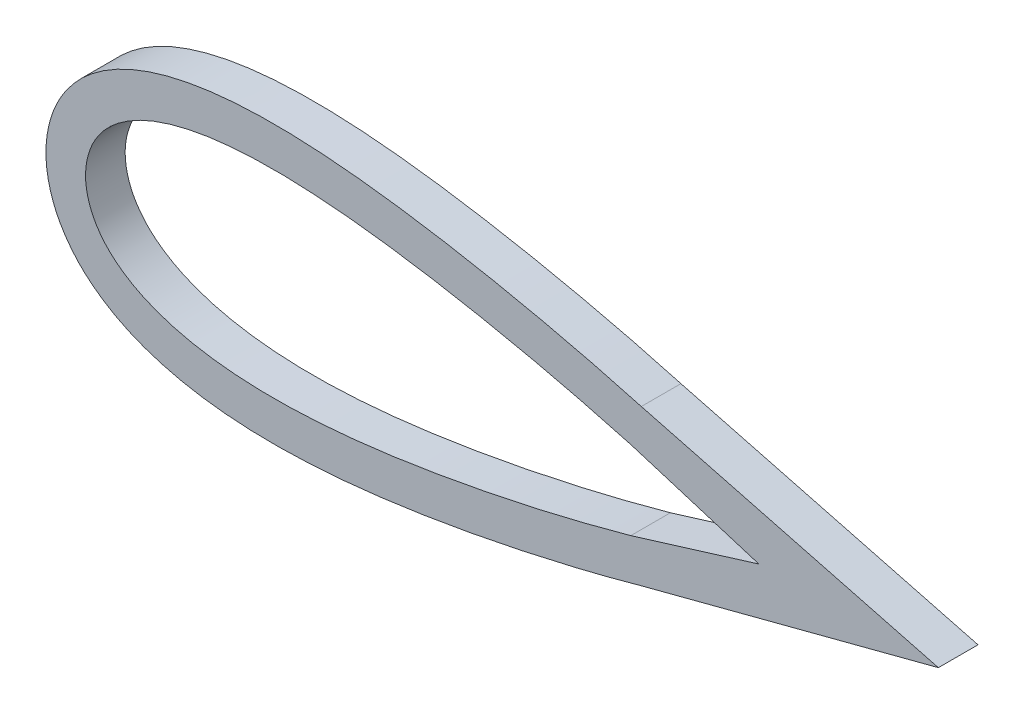
ISO-10303-21;
HEADER;
FILE_DESCRIPTION(('STEP AP214'),'2;1');
FILE_NAME('part.step','',(''),(''),'','','');
FILE_SCHEMA(('AUTOMOTIVE_DESIGN { 1 0 10303 214 1 1 1 1 }'));
ENDSEC;
DATA;
#1=APPLICATION_CONTEXT('core data for automotive mechanical design processes');
#2=APPLICATION_PROTOCOL_DEFINITION('international standard','automotive_design',2000,#1);
#3=PRODUCT_CONTEXT('',#1,'mechanical');
#4=PRODUCT('Part','Part','',(#3));
#5=PRODUCT_RELATED_PRODUCT_CATEGORY('part','',(#4));
#6=PRODUCT_DEFINITION_FORMATION('','',#4);
#7=PRODUCT_DEFINITION_CONTEXT('part definition',#1,'design');
#8=PRODUCT_DEFINITION('design','',#6,#7);
#9=PRODUCT_DEFINITION_SHAPE('','',#8);
#10=(LENGTH_UNIT() NAMED_UNIT(*) SI_UNIT(.MILLI.,.METRE.));
#11=(NAMED_UNIT(*) PLANE_ANGLE_UNIT() SI_UNIT($,.RADIAN.));
#12=(NAMED_UNIT(*) SI_UNIT($,.STERADIAN.) SOLID_ANGLE_UNIT());
#13=UNCERTAINTY_MEASURE_WITH_UNIT(LENGTH_MEASURE(1.E-05),#10,'distance_accuracy_value','');
#14=(GEOMETRIC_REPRESENTATION_CONTEXT(3) GLOBAL_UNCERTAINTY_ASSIGNED_CONTEXT((#13)) GLOBAL_UNIT_ASSIGNED_CONTEXT((#10,
#11,#12)) REPRESENTATION_CONTEXT('',''));
#15=CARTESIAN_POINT('',(0.,0.,0.));
#16=DIRECTION('',(0.,0.,1.));
#17=DIRECTION('',(1.,0.,0.));
#18=AXIS2_PLACEMENT_3D('',#15,#16,#17);
#19=CARTESIAN_POINT('',(-4.,0.,2.));
#20=DIRECTION('',(0.,0.,1.));
#21=DIRECTION('',(1.,0.,0.));
#22=AXIS2_PLACEMENT_3D('',#19,#20,#21);
#23=PLANE('',#22);
#24=CARTESIAN_POINT('',(26.0616102321761,3.91975075358007,2.));
#25=CARTESIAN_POINT('',(25.7908550986951,3.99428274822602,2.));
#26=CARTESIAN_POINT('',(25.2572126014541,4.14136507492807,2.));
#27=CARTESIAN_POINT('',(24.1247469848177,4.44323130166055,2.));
#28=CARTESIAN_POINT('',(22.178807464992,4.92776323908278,2.));
#29=CARTESIAN_POINT('',(19.379102393512,5.55440720582287,2.));
#30=CARTESIAN_POINT('',(15.9883837221789,6.19552196018369,2.));
#31=CARTESIAN_POINT('',(13.1047466874519,6.62265027549941,2.));
#32=CARTESIAN_POINT('',(10.7314984830104,6.86758341437452,2.));
#33=CARTESIAN_POINT('',(8.90776893424528,6.98611442432377,2.));
#34=CARTESIAN_POINT('',(7.03602239611878,7.01777389964808,2.));
#35=CARTESIAN_POINT('',(5.08145939443805,6.92637841983811,2.));
#36=CARTESIAN_POINT('',(3.37931928865612,6.70146918058769,2.));
#37=CARTESIAN_POINT('',(1.92260797544325,6.36268421578769,2.));
#38=CARTESIAN_POINT('',(0.787164302073277,5.99882341835593,2.));
#39=CARTESIAN_POINT('',(-0.443995263758301,5.45938053860723,2.));
#40=CARTESIAN_POINT('',(-1.58245280714408,4.72823063482928,2.));
#41=CARTESIAN_POINT('',(-2.53022890509633,3.8455632892832,2.));
#42=CARTESIAN_POINT('',(-3.30734443288278,2.79163041724491,2.));
#43=CARTESIAN_POINT('',(-3.74782183112722,1.7538731418132,2.));
#44=CARTESIAN_POINT('',(-3.95906342458137,0.798404691204324,2.));
#45=CARTESIAN_POINT('',(-4.02046828770932,0.,2.));
#46=CARTESIAN_POINT('',(-3.95906342458137,-0.798404691204312,2.));
#47=CARTESIAN_POINT('',(-3.74782183112722,-1.75387314181319,2.));
#48=CARTESIAN_POINT('',(-3.30734443288277,-2.79163041724492,2.));
#49=CARTESIAN_POINT('',(-2.53022890509634,-3.84556328928319,2.));
#50=CARTESIAN_POINT('',(-1.58245280714407,-4.72823063482929,2.));
#51=CARTESIAN_POINT('',(-0.443995263758309,-5.45938053860723,2.));
#52=CARTESIAN_POINT('',(0.787164302073289,-5.99882341835593,2.));
#53=CARTESIAN_POINT('',(1.92260797544325,-6.36268421578769,2.));
#54=CARTESIAN_POINT('',(3.3793192886561,-6.70146918058769,2.));
#55=CARTESIAN_POINT('',(5.08145939443804,-6.92637841983811,2.));
#56=CARTESIAN_POINT('',(7.03602239611877,-7.01777389964808,2.));
#57=CARTESIAN_POINT('',(8.90776893424527,-6.98611442432377,2.));
#58=CARTESIAN_POINT('',(10.7314984830104,-6.86758341437452,2.));
#59=CARTESIAN_POINT('',(13.1047466874519,-6.62265027549941,2.));
#60=CARTESIAN_POINT('',(15.9883837221789,-6.19552196018368,2.));
#61=CARTESIAN_POINT('',(19.379102393512,-5.55440720582288,2.));
#62=CARTESIAN_POINT('',(22.178807464992,-4.92776323908278,2.));
#63=CARTESIAN_POINT('',(24.1247469848177,-4.44323130166055,2.));
#64=CARTESIAN_POINT('',(25.2572126014541,-4.14136507492807,2.));
#65=CARTESIAN_POINT('',(25.7908550986951,-3.99428274822602,2.));
#66=CARTESIAN_POINT('',(26.0616102321761,-3.91975075358007,2.));
#67=B_SPLINE_CURVE_WITH_KNOTS('',3,(#24,#25,#26,#27,#28,#29,#30,#31,#32,#33,#34,#35,#36,#37,#38,
#39,#40,#41,#42,#43,#44,#45,#46,#47,#48,#49,#50,#51,#52,#53,#54,#55,#56,#57,#58,#59,#60,#61,#62,
#63,#64,#65,#66),.UNSPECIFIED.,.F.,.F.,(4,1,1,1,1,1,1,1,1,1,1,1,1,1,1,1,1,1,1,1,1,1,1,1,1,1,1,1,
1,1,1,1,1,1,1,1,1,1,1,1,4),(0.,0.015625,0.03125,0.0625,0.125,0.1875,0.25,0.28125,0.3125,0.34375,
0.375,0.40625,0.421875,0.4375,0.453125,0.46875,0.4765625,0.484375,0.4921875,0.49609375,0.5,
0.50390625,0.5078125,0.515625,0.5234375,0.53125,0.546875,0.5625,0.578125,0.59375,0.625,0.65625,
0.6875,0.71875,0.75,0.8125,0.875,0.9375,0.96875,0.984375,1.),.UNSPECIFIED.);
#68=CARTESIAN_POINT('',(26.0616102321761,3.91975075358007,2.));
#69=VERTEX_POINT('',#68);
#70=CARTESIAN_POINT('',(26.0616102321761,-3.91975075358007,2.));
#71=VERTEX_POINT('',#70);
#72=EDGE_CURVE('E121',#69,#71,#67,.T.);
#73=ORIENTED_EDGE('',*,*,#72,.T.);
#74=DIRECTION('',(0.967511520060154,0.252826933990212,0.));
#75=VECTOR('',#74,1.);
#76=CARTESIAN_POINT('',(41.0616102321761,0.,2.));
#77=LINE('',#76,#75);
#78=CARTESIAN_POINT('',(41.0616102321761,0.,2.));
#79=VERTEX_POINT('',#78);
#80=EDGE_CURVE('E127',#71,#79,#77,.T.);
#81=ORIENTED_EDGE('',*,*,#80,.T.);
#82=DIRECTION('',(-0.967511520060154,0.252826933990212,0.));
#83=VECTOR('',#82,1.);
#84=CARTESIAN_POINT('',(26.0616102321761,3.91975075358007,2.));
#85=LINE('',#84,#83);
#86=EDGE_CURVE('E133',#79,#69,#85,.T.);
#87=ORIENTED_EDGE('',*,*,#86,.T.);
#88=EDGE_LOOP('',(#73,#81,#87));
#89=FACE_BOUND('',#88,.T.);
#90=DIRECTION('',(0.955739389408659,0.294214580761669,0.));
#91=VECTOR('',#90,1.);
#92=CARTESIAN_POINT('',(32.,0.,2.));
#93=LINE('',#92,#91);
#94=CARTESIAN_POINT('',(25.5308051160881,-1.99147537679003,2.));
#95=VERTEX_POINT('',#94);
#96=CARTESIAN_POINT('',(32.,0.,2.));
#97=VERTEX_POINT('',#96);
#98=EDGE_CURVE('E95',#95,#97,#93,.T.);
#99=ORIENTED_EDGE('',*,*,#98,.F.);
#100=CARTESIAN_POINT('',(25.5308051160881,1.99147537679003,2.));
#101=CARTESIAN_POINT('',(24.4463392157988,2.29000122793419,2.));
#102=CARTESIAN_POINT('',(22.2703077952512,2.86117302398535,2.));
#103=CARTESIAN_POINT('',(18.9742697593145,3.59450376523772,2.));
#104=CARTESIAN_POINT('',(15.6525569701302,4.22368797294328,2.));
#105=CARTESIAN_POINT('',(12.8457404121472,4.63875597179699,2.));
#106=CARTESIAN_POINT('',(10.5613216904194,4.87435168481218,2.));
#107=CARTESIAN_POINT('',(8.82315350493151,4.98718685824737,2.));
#108=CARTESIAN_POINT('',(7.05943053398269,5.01653026167085,2.));
#109=CARTESIAN_POINT('',(5.25488898266239,4.93166756807241,2.));
#110=CARTESIAN_POINT('',(3.71930264407939,4.72712746911892,2.));
#111=CARTESIAN_POINT('',(2.45286659519593,4.43200097009651,2.));
#112=CARTESIAN_POINT('',(1.49065329997453,4.12286560931984,2.));
#113=CARTESIAN_POINT('',(0.496556605779251,3.68493538075289,2.));
#114=CARTESIAN_POINT('',(-0.364078905316625,3.12865583071634,2.));
#115=CARTESIAN_POINT('',(-1.03788003321055,2.49757525417018,2.));
#116=CARTESIAN_POINT('',(-1.54945829800341,1.79907938161502,2.));
#117=CARTESIAN_POINT('',(-1.89687812142861,0.988542336846109,2.));
#118=CARTESIAN_POINT('',(-2.0515609392857,0.,2.));
#119=CARTESIAN_POINT('',(-1.89687812142861,-0.988542336846106,2.));
#120=CARTESIAN_POINT('',(-1.54945829800341,-1.79907938161502,2.));
#121=CARTESIAN_POINT('',(-1.03788003321055,-2.49757525417018,2.));
#122=CARTESIAN_POINT('',(-0.364078905316623,-3.12865583071634,2.));
#123=CARTESIAN_POINT('',(0.496556605779247,-3.68493538075289,2.));
#124=CARTESIAN_POINT('',(1.49065329997454,-4.12286560931984,2.));
#125=CARTESIAN_POINT('',(2.45286659519594,-4.43200097009651,2.));
#126=CARTESIAN_POINT('',(3.71930264407939,-4.72712746911892,2.));
#127=CARTESIAN_POINT('',(5.25488898266239,-4.93166756807241,2.));
#128=CARTESIAN_POINT('',(7.05943053398268,-5.01653026167085,2.));
#129=CARTESIAN_POINT('',(8.8231535049315,-4.98718685824737,2.));
#130=CARTESIAN_POINT('',(10.5613216904194,-4.87435168481218,2.));
#131=CARTESIAN_POINT('',(12.8457404121472,-4.638755971797,2.));
#132=CARTESIAN_POINT('',(15.6525569701302,-4.22368797294328,2.));
#133=CARTESIAN_POINT('',(18.9742697593145,-3.59450376523772,2.));
#134=CARTESIAN_POINT('',(22.2703077952512,-2.86117302398535,2.));
#135=CARTESIAN_POINT('',(24.4463392157988,-2.29000122793419,2.));
#136=CARTESIAN_POINT('',(25.5308051160881,-1.99147537679003,2.));
#137=B_SPLINE_CURVE_WITH_KNOTS('',3,(#100,#101,#102,#103,#104,#105,#106,#107,#108,#109,#110,
#111,#112,#113,#114,#115,#116,#117,#118,#119,#120,#121,#122,#123,#124,#125,#126,#127,#128,#129,
#130,#131,#132,#133,#134,#135,#136),.UNSPECIFIED.,.F.,.F.,(4,1,1,1,1,1,1,1,1,1,1,1,1,1,1,1,1,1,
1,1,1,1,1,1,1,1,1,1,1,1,1,1,1,1,4),(0.,0.0625,0.125,0.1875,0.25,0.28125,0.3125,0.34375,0.375,
0.40625,0.421875,0.4375,0.453125,0.46875,0.4765625,0.484375,0.4921875,0.5,0.5078125,0.515625,
0.5234375,0.53125,0.546875,0.5625,0.578125,0.59375,0.625,0.65625,0.6875,0.71875,0.75,0.8125,
0.875,0.9375,1.),.UNSPECIFIED.);
#138=CARTESIAN_POINT('',(25.5308051160881,1.99147537679003,2.));
#139=VERTEX_POINT('',#138);
#140=EDGE_CURVE('E87',#139,#95,#137,.T.);
#141=ORIENTED_EDGE('',*,*,#140,.F.);
#142=DIRECTION('',(-0.955739389408659,0.294214580761669,0.));
#143=VECTOR('',#142,1.);
#144=CARTESIAN_POINT('',(25.5308051160881,1.99147537679003,2.));
#145=LINE('',#144,#143);
#146=EDGE_CURVE('E104',#97,#139,#145,.T.);
#147=ORIENTED_EDGE('',*,*,#146,.F.);
#148=EDGE_LOOP('',(#99,#141,#147));
#149=FACE_BOUND('',#148,.T.);
#150=ADVANCED_FACE('F33',(#89,#149),#23,.T.);
#151=CARTESIAN_POINT('',(-4.,0.,0.));
#152=DIRECTION('',(0.,0.,1.));
#153=DIRECTION('',(1.,0.,0.));
#154=AXIS2_PLACEMENT_3D('',#151,#152,#153);
#155=PLANE('',#154);
#156=CARTESIAN_POINT('',(26.0616102321761,3.91975075358007,0.));
#157=CARTESIAN_POINT('',(25.7908550986951,3.99428274822602,0.));
#158=CARTESIAN_POINT('',(25.2572126014541,4.14136507492807,0.));
#159=CARTESIAN_POINT('',(24.1247469848177,4.44323130166055,0.));
#160=CARTESIAN_POINT('',(22.178807464992,4.92776323908278,0.));
#161=CARTESIAN_POINT('',(19.379102393512,5.55440720582287,0.));
#162=CARTESIAN_POINT('',(15.9883837221789,6.19552196018369,0.));
#163=CARTESIAN_POINT('',(13.1047466874519,6.62265027549941,0.));
#164=CARTESIAN_POINT('',(10.7314984830104,6.86758341437452,0.));
#165=CARTESIAN_POINT('',(8.90776893424528,6.98611442432377,0.));
#166=CARTESIAN_POINT('',(7.03602239611878,7.01777389964808,0.));
#167=CARTESIAN_POINT('',(5.08145939443805,6.92637841983811,0.));
#168=CARTESIAN_POINT('',(3.37931928865612,6.70146918058769,0.));
#169=CARTESIAN_POINT('',(1.92260797544325,6.36268421578769,0.));
#170=CARTESIAN_POINT('',(0.787164302073277,5.99882341835593,0.));
#171=CARTESIAN_POINT('',(-0.443995263758301,5.45938053860723,0.));
#172=CARTESIAN_POINT('',(-1.58245280714408,4.72823063482928,0.));
#173=CARTESIAN_POINT('',(-2.53022890509633,3.8455632892832,0.));
#174=CARTESIAN_POINT('',(-3.30734443288278,2.79163041724491,0.));
#175=CARTESIAN_POINT('',(-3.74782183112722,1.7538731418132,0.));
#176=CARTESIAN_POINT('',(-3.95906342458137,0.798404691204324,0.));
#177=CARTESIAN_POINT('',(-4.02046828770932,0.,0.));
#178=CARTESIAN_POINT('',(-3.95906342458137,-0.798404691204312,0.));
#179=CARTESIAN_POINT('',(-3.74782183112722,-1.75387314181319,0.));
#180=CARTESIAN_POINT('',(-3.30734443288277,-2.79163041724492,0.));
#181=CARTESIAN_POINT('',(-2.53022890509634,-3.84556328928319,0.));
#182=CARTESIAN_POINT('',(-1.58245280714407,-4.72823063482929,0.));
#183=CARTESIAN_POINT('',(-0.443995263758309,-5.45938053860723,0.));
#184=CARTESIAN_POINT('',(0.787164302073289,-5.99882341835593,0.));
#185=CARTESIAN_POINT('',(1.92260797544325,-6.36268421578769,0.));
#186=CARTESIAN_POINT('',(3.3793192886561,-6.70146918058769,0.));
#187=CARTESIAN_POINT('',(5.08145939443804,-6.92637841983811,0.));
#188=CARTESIAN_POINT('',(7.03602239611877,-7.01777389964808,0.));
#189=CARTESIAN_POINT('',(8.90776893424527,-6.98611442432377,0.));
#190=CARTESIAN_POINT('',(10.7314984830104,-6.86758341437452,0.));
#191=CARTESIAN_POINT('',(13.1047466874519,-6.62265027549941,0.));
#192=CARTESIAN_POINT('',(15.9883837221789,-6.19552196018368,0.));
#193=CARTESIAN_POINT('',(19.379102393512,-5.55440720582288,0.));
#194=CARTESIAN_POINT('',(22.178807464992,-4.92776323908278,0.));
#195=CARTESIAN_POINT('',(24.1247469848177,-4.44323130166055,0.));
#196=CARTESIAN_POINT('',(25.2572126014541,-4.14136507492807,0.));
#197=CARTESIAN_POINT('',(25.7908550986951,-3.99428274822602,0.));
#198=CARTESIAN_POINT('',(26.0616102321761,-3.91975075358007,0.));
#199=B_SPLINE_CURVE_WITH_KNOTS('',3,(#156,#157,#158,#159,#160,#161,#162,#163,#164,#165,#166,
#167,#168,#169,#170,#171,#172,#173,#174,#175,#176,#177,#178,#179,#180,#181,#182,#183,#184,#185,
#186,#187,#188,#189,#190,#191,#192,#193,#194,#195,#196,#197,#198),.UNSPECIFIED.,.F.,.F.,(4,1,1,
1,1,1,1,1,1,1,1,1,1,1,1,1,1,1,1,1,1,1,1,1,1,1,1,1,1,1,1,1,1,1,1,1,1,1,1,1,4),(0.,0.015625,
0.03125,0.0625,0.125,0.1875,0.25,0.28125,0.3125,0.34375,0.375,0.40625,0.421875,0.4375,0.453125,
0.46875,0.4765625,0.484375,0.4921875,0.49609375,0.5,0.50390625,0.5078125,0.515625,0.5234375,
0.53125,0.546875,0.5625,0.578125,0.59375,0.625,0.65625,0.6875,0.71875,0.75,0.8125,0.875,0.9375,
0.96875,0.984375,1.),.UNSPECIFIED.);
#200=CARTESIAN_POINT('',(26.0616102321761,3.91975075358007,0.));
#201=VERTEX_POINT('',#200);
#202=CARTESIAN_POINT('',(26.0616102321761,-3.91975075358007,0.));
#203=VERTEX_POINT('',#202);
#204=EDGE_CURVE('E102',#201,#203,#199,.T.);
#205=ORIENTED_EDGE('',*,*,#204,.F.);
#206=DIRECTION('',(-0.967511520060154,0.252826933990212,0.));
#207=VECTOR('',#206,1.);
#208=CARTESIAN_POINT('',(26.0616102321761,3.91975075358007,0.));
#209=LINE('',#208,#207);
#210=CARTESIAN_POINT('',(41.0616102321761,0.,0.));
#211=VERTEX_POINT('',#210);
#212=EDGE_CURVE('E128',#211,#201,#209,.T.);
#213=ORIENTED_EDGE('',*,*,#212,.F.);
#214=DIRECTION('',(0.967511520060154,0.252826933990212,0.));
#215=VECTOR('',#214,1.);
#216=CARTESIAN_POINT('',(41.0616102321761,0.,0.));
#217=LINE('',#216,#215);
#218=EDGE_CURVE('E140',#203,#211,#217,.T.);
#219=ORIENTED_EDGE('',*,*,#218,.F.);
#220=EDGE_LOOP('',(#205,#213,#219));
#221=FACE_BOUND('',#220,.T.);
#222=CARTESIAN_POINT('',(25.5308051160881,1.99147537679003,0.));
#223=CARTESIAN_POINT('',(24.4463392157988,2.29000122793419,0.));
#224=CARTESIAN_POINT('',(22.2703077952512,2.86117302398535,0.));
#225=CARTESIAN_POINT('',(18.9742697593145,3.59450376523772,0.));
#226=CARTESIAN_POINT('',(15.6525569701302,4.22368797294328,0.));
#227=CARTESIAN_POINT('',(12.8457404121472,4.63875597179699,0.));
#228=CARTESIAN_POINT('',(10.5613216904194,4.87435168481218,0.));
#229=CARTESIAN_POINT('',(8.82315350493151,4.98718685824737,0.));
#230=CARTESIAN_POINT('',(7.05943053398269,5.01653026167085,0.));
#231=CARTESIAN_POINT('',(5.25488898266239,4.93166756807241,0.));
#232=CARTESIAN_POINT('',(3.71930264407939,4.72712746911892,0.));
#233=CARTESIAN_POINT('',(2.45286659519593,4.43200097009651,0.));
#234=CARTESIAN_POINT('',(1.49065329997453,4.12286560931984,0.));
#235=CARTESIAN_POINT('',(0.496556605779251,3.68493538075289,0.));
#236=CARTESIAN_POINT('',(-0.364078905316625,3.12865583071634,0.));
#237=CARTESIAN_POINT('',(-1.03788003321055,2.49757525417018,0.));
#238=CARTESIAN_POINT('',(-1.54945829800341,1.79907938161502,0.));
#239=CARTESIAN_POINT('',(-1.89687812142861,0.988542336846109,0.));
#240=CARTESIAN_POINT('',(-2.0515609392857,0.,0.));
#241=CARTESIAN_POINT('',(-1.89687812142861,-0.988542336846106,0.));
#242=CARTESIAN_POINT('',(-1.54945829800341,-1.79907938161502,0.));
#243=CARTESIAN_POINT('',(-1.03788003321055,-2.49757525417018,0.));
#244=CARTESIAN_POINT('',(-0.364078905316623,-3.12865583071634,0.));
#245=CARTESIAN_POINT('',(0.496556605779247,-3.68493538075289,0.));
#246=CARTESIAN_POINT('',(1.49065329997454,-4.12286560931984,0.));
#247=CARTESIAN_POINT('',(2.45286659519594,-4.43200097009651,0.));
#248=CARTESIAN_POINT('',(3.71930264407939,-4.72712746911892,0.));
#249=CARTESIAN_POINT('',(5.25488898266239,-4.93166756807241,0.));
#250=CARTESIAN_POINT('',(7.05943053398268,-5.01653026167085,0.));
#251=CARTESIAN_POINT('',(8.8231535049315,-4.98718685824737,0.));
#252=CARTESIAN_POINT('',(10.5613216904194,-4.87435168481218,0.));
#253=CARTESIAN_POINT('',(12.8457404121472,-4.638755971797,0.));
#254=CARTESIAN_POINT('',(15.6525569701302,-4.22368797294328,0.));
#255=CARTESIAN_POINT('',(18.9742697593145,-3.59450376523772,0.));
#256=CARTESIAN_POINT('',(22.2703077952512,-2.86117302398535,0.));
#257=CARTESIAN_POINT('',(24.4463392157988,-2.29000122793419,0.));
#258=CARTESIAN_POINT('',(25.5308051160881,-1.99147537679003,0.));
#259=B_SPLINE_CURVE_WITH_KNOTS('',3,(#222,#223,#224,#225,#226,#227,#228,#229,#230,#231,#232,
#233,#234,#235,#236,#237,#238,#239,#240,#241,#242,#243,#244,#245,#246,#247,#248,#249,#250,#251,
#252,#253,#254,#255,#256,#257,#258),.UNSPECIFIED.,.F.,.F.,(4,1,1,1,1,1,1,1,1,1,1,1,1,1,1,1,1,1,
1,1,1,1,1,1,1,1,1,1,1,1,1,1,1,1,4),(0.,0.0625,0.125,0.1875,0.25,0.28125,0.3125,0.34375,0.375,
0.40625,0.421875,0.4375,0.453125,0.46875,0.4765625,0.484375,0.4921875,0.5,0.5078125,0.515625,
0.5234375,0.53125,0.546875,0.5625,0.578125,0.59375,0.625,0.65625,0.6875,0.71875,0.75,0.8125,
0.875,0.9375,1.),.UNSPECIFIED.);
#260=CARTESIAN_POINT('',(25.5308051160881,1.99147537679003,0.));
#261=VERTEX_POINT('',#260);
#262=CARTESIAN_POINT('',(25.5308051160881,-1.99147537679003,0.));
#263=VERTEX_POINT('',#262);
#264=EDGE_CURVE('E57',#261,#263,#259,.T.);
#265=ORIENTED_EDGE('',*,*,#264,.T.);
#266=DIRECTION('',(0.955739389408659,0.294214580761669,0.));
#267=VECTOR('',#266,1.);
#268=CARTESIAN_POINT('',(32.,0.,0.));
#269=LINE('',#268,#267);
#270=CARTESIAN_POINT('',(32.,0.,0.));
#271=VERTEX_POINT('',#270);
#272=EDGE_CURVE('E101',#263,#271,#269,.T.);
#273=ORIENTED_EDGE('',*,*,#272,.T.);
#274=DIRECTION('',(-0.955739389408659,0.294214580761669,0.));
#275=VECTOR('',#274,1.);
#276=CARTESIAN_POINT('',(25.5308051160881,1.99147537679003,0.));
#277=LINE('',#276,#275);
#278=EDGE_CURVE('E96',#271,#261,#277,.T.);
#279=ORIENTED_EDGE('',*,*,#278,.T.);
#280=EDGE_LOOP('',(#265,#273,#279));
#281=FACE_BOUND('',#280,.T.);
#282=ADVANCED_FACE('F157',(#221,#281),#155,.F.);
#283=DIRECTION('',(0.,0.,-1.));
#284=VECTOR('',#283,1.);
#285=SURFACE_OF_LINEAR_EXTRUSION('',#67,#284);
#286=ORIENTED_EDGE('',*,*,#204,.T.);
#287=DIRECTION('',(0.,0.,-1.));
#288=VECTOR('',#287,1.);
#289=CARTESIAN_POINT('',(26.0616102321761,-3.91975075358007,2.));
#290=LINE('',#289,#288);
#291=EDGE_CURVE('E11',#71,#203,#290,.T.);
#292=ORIENTED_EDGE('',*,*,#291,.F.);
#293=ORIENTED_EDGE('',*,*,#72,.F.);
#294=DIRECTION('',(0.,0.,-1.));
#295=VECTOR('',#294,1.);
#296=CARTESIAN_POINT('',(26.0616102321761,3.91975075358007,2.));
#297=LINE('',#296,#295);
#298=EDGE_CURVE('E135',#69,#201,#297,.T.);
#299=ORIENTED_EDGE('',*,*,#298,.T.);
#300=EDGE_LOOP('',(#286,#292,#293,#299));
#301=FACE_BOUND('',#300,.T.);
#302=ADVANCED_FACE('F35',(#301),#285,.F.);
#303=CARTESIAN_POINT('',(41.0616102321761,0.,2.));
#304=DIRECTION('',(-0.252826933990212,0.967511520060154,0.));
#305=DIRECTION('',(-0.967511520060154,-0.252826933990212,0.));
#306=AXIS2_PLACEMENT_3D('',#303,#304,#305);
#307=PLANE('',#306);
#308=ORIENTED_EDGE('',*,*,#218,.T.);
#309=DIRECTION('',(0.,0.,-1.));
#310=VECTOR('',#309,1.);
#311=CARTESIAN_POINT('',(41.0616102321761,0.,2.));
#312=LINE('',#311,#310);
#313=EDGE_CURVE('E42',#79,#211,#312,.T.);
#314=ORIENTED_EDGE('',*,*,#313,.F.);
#315=ORIENTED_EDGE('',*,*,#80,.F.);
#316=ORIENTED_EDGE('',*,*,#291,.T.);
#317=EDGE_LOOP('',(#308,#314,#315,#316));
#318=FACE_BOUND('',#317,.T.);
#319=ADVANCED_FACE('F163',(#318),#307,.F.);
#320=CARTESIAN_POINT('',(26.0616102321761,3.91975075358007,2.));
#321=DIRECTION('',(-0.252826933990212,-0.967511520060154,0.));
#322=DIRECTION('',(0.967511520060154,-0.252826933990212,0.));
#323=AXIS2_PLACEMENT_3D('',#320,#321,#322);
#324=PLANE('',#323);
#325=ORIENTED_EDGE('',*,*,#212,.T.);
#326=ORIENTED_EDGE('',*,*,#298,.F.);
#327=ORIENTED_EDGE('',*,*,#86,.F.);
#328=ORIENTED_EDGE('',*,*,#313,.T.);
#329=EDGE_LOOP('',(#325,#326,#327,#328));
#330=FACE_BOUND('',#329,.T.);
#331=ADVANCED_FACE('F152',(#330),#324,.F.);
#332=DIRECTION('',(0.,0.,-1.));
#333=VECTOR('',#332,1.);
#334=SURFACE_OF_LINEAR_EXTRUSION('',#137,#333);
#335=ORIENTED_EDGE('',*,*,#264,.F.);
#336=DIRECTION('',(0.,0.,-1.));
#337=VECTOR('',#336,1.);
#338=CARTESIAN_POINT('',(25.5308051160881,1.99147537679003,2.));
#339=LINE('',#338,#337);
#340=EDGE_CURVE('E91',#139,#261,#339,.T.);
#341=ORIENTED_EDGE('',*,*,#340,.F.);
#342=ORIENTED_EDGE('',*,*,#140,.T.);
#343=DIRECTION('',(0.,0.,-1.));
#344=VECTOR('',#343,1.);
#345=CARTESIAN_POINT('',(25.5308051160881,-1.99147537679003,2.));
#346=LINE('',#345,#344);
#347=EDGE_CURVE('E90',#95,#263,#346,.T.);
#348=ORIENTED_EDGE('',*,*,#347,.T.);
#349=EDGE_LOOP('',(#335,#341,#342,#348));
#350=FACE_BOUND('',#349,.T.);
#351=ADVANCED_FACE('F89',(#350),#334,.T.);
#352=CARTESIAN_POINT('',(32.,0.,2.));
#353=DIRECTION('',(-0.294214580761669,0.955739389408659,0.));
#354=DIRECTION('',(-0.955739389408659,-0.294214580761669,0.));
#355=AXIS2_PLACEMENT_3D('',#352,#353,#354);
#356=PLANE('',#355);
#357=ORIENTED_EDGE('',*,*,#272,.F.);
#358=ORIENTED_EDGE('',*,*,#347,.F.);
#359=ORIENTED_EDGE('',*,*,#98,.T.);
#360=DIRECTION('',(0.,0.,-1.));
#361=VECTOR('',#360,1.);
#362=CARTESIAN_POINT('',(32.,0.,2.));
#363=LINE('',#362,#361);
#364=EDGE_CURVE('E49',#97,#271,#363,.T.);
#365=ORIENTED_EDGE('',*,*,#364,.T.);
#366=EDGE_LOOP('',(#357,#358,#359,#365));
#367=FACE_BOUND('',#366,.T.);
#368=ADVANCED_FACE('F99',(#367),#356,.T.);
#369=CARTESIAN_POINT('',(25.5308051160881,1.99147537679003,2.));
#370=DIRECTION('',(-0.294214580761669,-0.955739389408658,0.));
#371=DIRECTION('',(0.955739389408659,-0.294214580761669,0.));
#372=AXIS2_PLACEMENT_3D('',#369,#370,#371);
#373=PLANE('',#372);
#374=ORIENTED_EDGE('',*,*,#278,.F.);
#375=ORIENTED_EDGE('',*,*,#364,.F.);
#376=ORIENTED_EDGE('',*,*,#146,.T.);
#377=ORIENTED_EDGE('',*,*,#340,.T.);
#378=EDGE_LOOP('',(#374,#375,#376,#377));
#379=FACE_BOUND('',#378,.T.);
#380=ADVANCED_FACE('F181',(#379),#373,.T.);
#381=CLOSED_SHELL('',(#150,#282,#302,#319,#331,#351,#368,#380));
#382=MANIFOLD_SOLID_BREP('B2',#381);
#383=ADVANCED_BREP_SHAPE_REPRESENTATION('',(#18,#382),#14);
#384=SHAPE_DEFINITION_REPRESENTATION(#9,#383);
ENDSEC;
END-ISO-10303-21;
